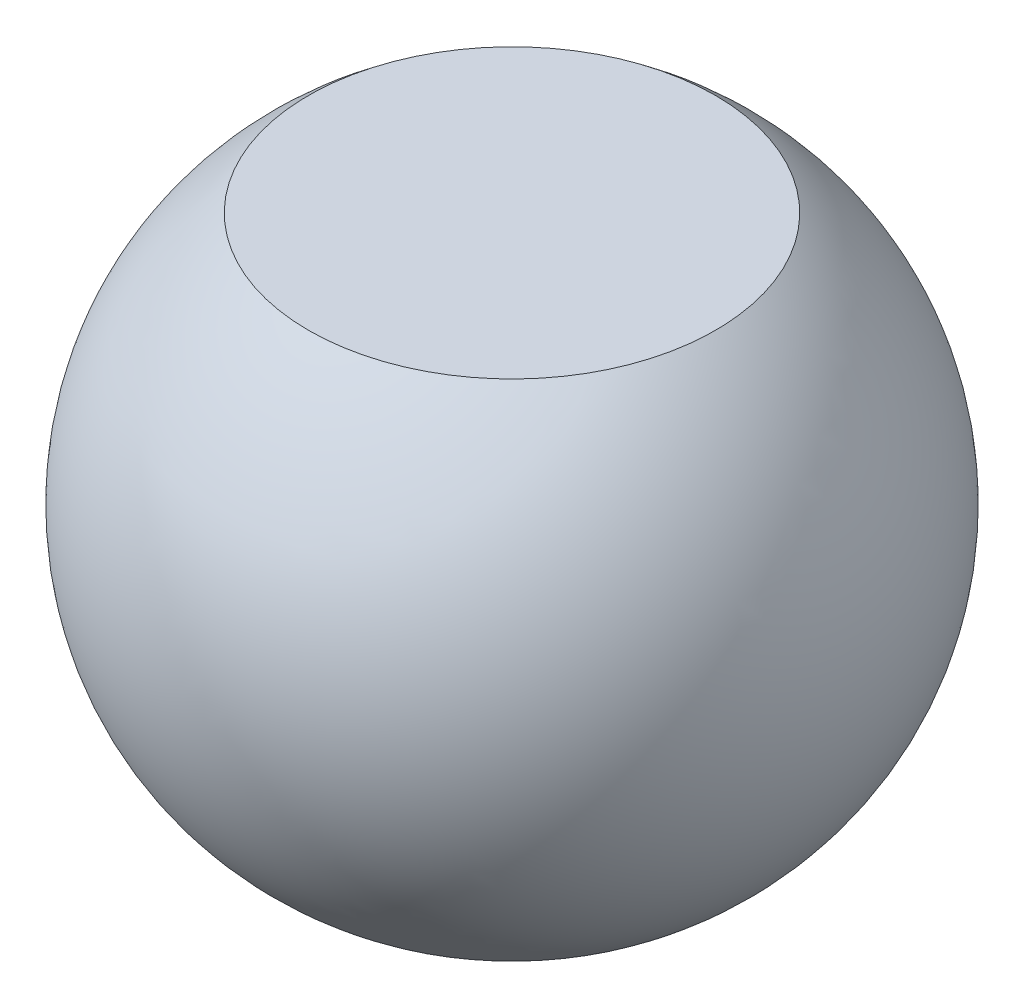
ISO-10303-21;
HEADER;
FILE_DESCRIPTION(('STEP AP214'),'2;1');
FILE_NAME('part.step','',(''),(''),'','','');
FILE_SCHEMA(('AUTOMOTIVE_DESIGN { 1 0 10303 214 1 1 1 1 }'));
ENDSEC;
DATA;
#1=APPLICATION_CONTEXT('core data for automotive mechanical design processes');
#2=APPLICATION_PROTOCOL_DEFINITION('international standard','automotive_design',2000,#1);
#3=PRODUCT_CONTEXT('',#1,'mechanical');
#4=PRODUCT('Part','Part','',(#3));
#5=PRODUCT_RELATED_PRODUCT_CATEGORY('part','',(#4));
#6=PRODUCT_DEFINITION_FORMATION('','',#4);
#7=PRODUCT_DEFINITION_CONTEXT('part definition',#1,'design');
#8=PRODUCT_DEFINITION('design','',#6,#7);
#9=PRODUCT_DEFINITION_SHAPE('','',#8);
#10=(LENGTH_UNIT() NAMED_UNIT(*) SI_UNIT(.MILLI.,.METRE.));
#11=(NAMED_UNIT(*) PLANE_ANGLE_UNIT() SI_UNIT($,.RADIAN.));
#12=(NAMED_UNIT(*) SI_UNIT($,.STERADIAN.) SOLID_ANGLE_UNIT());
#13=UNCERTAINTY_MEASURE_WITH_UNIT(LENGTH_MEASURE(1.E-05),#10,'distance_accuracy_value','');
#14=(GEOMETRIC_REPRESENTATION_CONTEXT(3) GLOBAL_UNCERTAINTY_ASSIGNED_CONTEXT((#13)) GLOBAL_UNIT_ASSIGNED_CONTEXT((#10,
#11,#12)) REPRESENTATION_CONTEXT('',''));
#15=CARTESIAN_POINT('',(0.,0.,0.));
#16=DIRECTION('',(0.,0.,1.));
#17=DIRECTION('',(1.,0.,0.));
#18=AXIS2_PLACEMENT_3D('',#15,#16,#17);
#19=CARTESIAN_POINT('',(0.,0.,-323.));
#20=DIRECTION('',(0.,-1.,0.));
#21=DIRECTION('',(0.,0.,-1.));
#22=AXIS2_PLACEMENT_3D('',#19,#20,#21);
#23=PLANE('',#22);
#24=CARTESIAN_POINT('',(0.,0.,0.));
#25=DIRECTION('',(0.,-1.,0.));
#26=DIRECTION('',(0.,0.,-1.));
#27=AXIS2_PLACEMENT_3D('',#24,#25,#26);
#28=CIRCLE('',#27,323.);
#29=CARTESIAN_POINT('',(0.,0.,-323.));
#30=VERTEX_POINT('',#29);
#31=EDGE_CURVE('E10',#30,#30,#28,.T.);
#32=ORIENTED_EDGE('',*,*,#31,.T.);
#33=EDGE_LOOP('',(#32));
#34=FACE_BOUND('',#33,.T.);
#35=ADVANCED_FACE('F30',(#34),#23,.T.);
#36=CARTESIAN_POINT('',(0.,403.027996352067,0.));
#37=DIRECTION('',(0.,-1.,0.));
#38=DIRECTION('',(0.,0.,-1.));
#39=AXIS2_PLACEMENT_3D('',#36,#37,#38);
#40=DEGENERATE_TOROIDAL_SURFACE('',#39,23.7134581100616,502.,.T.);
#41=CARTESIAN_POINT('',(0.,805.,0.));
#42=DIRECTION('',(0.,-1.,0.));
#43=DIRECTION('',(0.,0.,-1.));
#44=AXIS2_PLACEMENT_3D('',#41,#42,#43);
#45=CIRCLE('',#44,324.416814066171);
#46=CARTESIAN_POINT('',(0.,805.,-324.416814066171));
#47=VERTEX_POINT('',#46);
#48=EDGE_CURVE('E36',#47,#47,#45,.T.);
#49=ORIENTED_EDGE('',*,*,#48,.T.);
#50=EDGE_LOOP('',(#49));
#51=FACE_BOUND('',#50,.T.);
#52=ORIENTED_EDGE('',*,*,#31,.F.);
#53=EDGE_LOOP('',(#52));
#54=FACE_BOUND('',#53,.T.);
#55=ADVANCED_FACE('F42',(#51,#54),#40,.T.);
#56=CARTESIAN_POINT('',(0.,805.,0.));
#57=DIRECTION('',(0.,1.,0.));
#58=DIRECTION('',(0.,0.,1.));
#59=AXIS2_PLACEMENT_3D('',#56,#57,#58);
#60=PLANE('',#59);
#61=ORIENTED_EDGE('',*,*,#48,.F.);
#62=EDGE_LOOP('',(#61));
#63=FACE_BOUND('',#62,.T.);
#64=ADVANCED_FACE('F45',(#63),#60,.T.);
#65=CLOSED_SHELL('',(#35,#55,#64));
#66=MANIFOLD_SOLID_BREP('B2',#65);
#67=ADVANCED_BREP_SHAPE_REPRESENTATION('',(#18,#66),#14);
#68=SHAPE_DEFINITION_REPRESENTATION(#9,#67);
ENDSEC;
END-ISO-10303-21;
